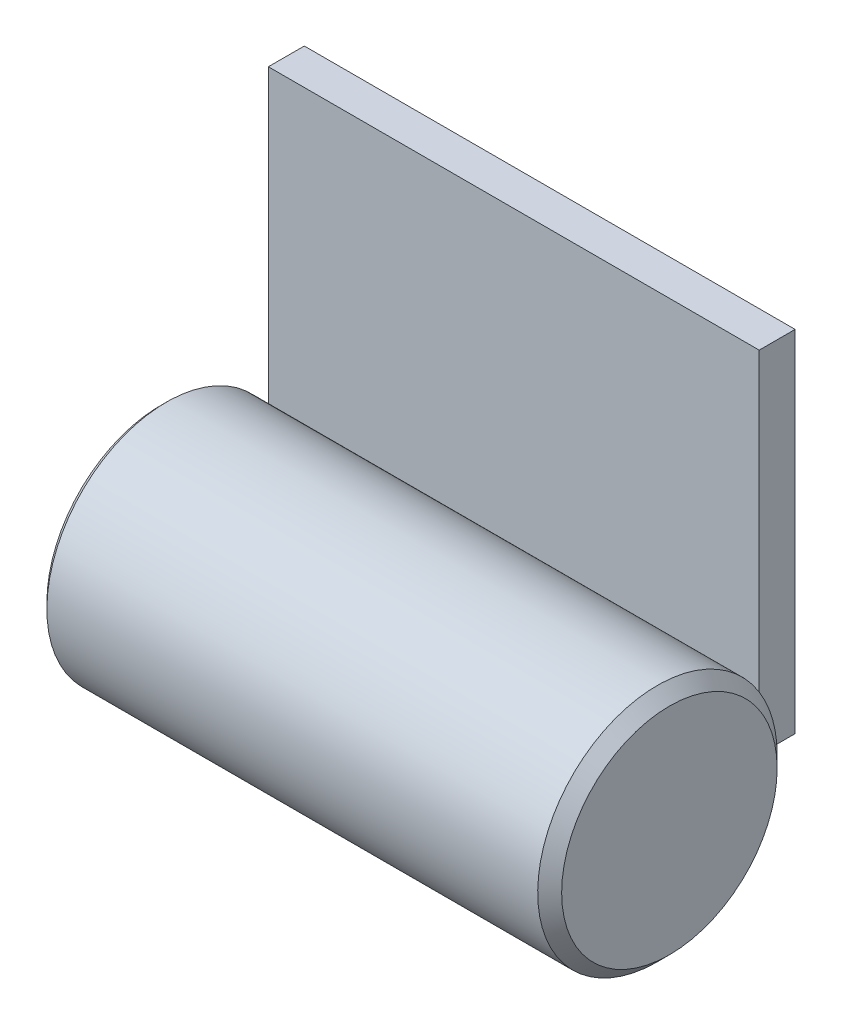
ISO-10303-21;
HEADER;
FILE_DESCRIPTION(('STEP AP214'),'2;1');
FILE_NAME('part.step','',(''),(''),'','','');
FILE_SCHEMA(('AUTOMOTIVE_DESIGN { 1 0 10303 214 1 1 1 1 }'));
ENDSEC;
DATA;
#1=APPLICATION_CONTEXT('core data for automotive mechanical design processes');
#2=APPLICATION_PROTOCOL_DEFINITION('international standard','automotive_design',2000,#1);
#3=PRODUCT_CONTEXT('',#1,'mechanical');
#4=PRODUCT('Part','Part','',(#3));
#5=PRODUCT_RELATED_PRODUCT_CATEGORY('part','',(#4));
#6=PRODUCT_DEFINITION_FORMATION('','',#4);
#7=PRODUCT_DEFINITION_CONTEXT('part definition',#1,'design');
#8=PRODUCT_DEFINITION('design','',#6,#7);
#9=PRODUCT_DEFINITION_SHAPE('','',#8);
#10=(LENGTH_UNIT() NAMED_UNIT(*) SI_UNIT(.MILLI.,.METRE.));
#11=(NAMED_UNIT(*) PLANE_ANGLE_UNIT() SI_UNIT($,.RADIAN.));
#12=(NAMED_UNIT(*) SI_UNIT($,.STERADIAN.) SOLID_ANGLE_UNIT());
#13=UNCERTAINTY_MEASURE_WITH_UNIT(LENGTH_MEASURE(1.E-05),#10,'distance_accuracy_value','');
#14=(GEOMETRIC_REPRESENTATION_CONTEXT(3) GLOBAL_UNCERTAINTY_ASSIGNED_CONTEXT((#13)) GLOBAL_UNIT_ASSIGNED_CONTEXT((#10,
#11,#12)) REPRESENTATION_CONTEXT('',''));
#15=CARTESIAN_POINT('',(0.,0.,0.));
#16=DIRECTION('',(0.,0.,1.));
#17=DIRECTION('',(1.,0.,0.));
#18=AXIS2_PLACEMENT_3D('',#15,#16,#17);
#19=CARTESIAN_POINT('',(90.6528747196546,60.,-23.0049280207155));
#20=DIRECTION('',(0.,0.,1.));
#21=DIRECTION('',(1.,0.,0.));
#22=AXIS2_PLACEMENT_3D('',#19,#20,#21);
#23=PLANE('',#22);
#24=DIRECTION('',(1.,0.,0.));
#25=VECTOR('',#24,1.);
#26=CARTESIAN_POINT('',(90.6528747196546,1.5,-23.0049280207155));
#27=LINE('',#26,#25);
#28=CARTESIAN_POINT('',(8.6528747196546,1.5,-23.0049280207155));
#29=VERTEX_POINT('',#28);
#30=CARTESIAN_POINT('',(90.6528747196546,1.5,-23.0049280207155));
#31=VERTEX_POINT('',#30);
#32=EDGE_CURVE('E102',#29,#31,#27,.T.);
#33=ORIENTED_EDGE('',*,*,#32,.F.);
#34=DIRECTION('',(0.,-1.,0.));
#35=VECTOR('',#34,1.);
#36=CARTESIAN_POINT('',(8.6528747196546,60.,-23.0049280207155));
#37=LINE('',#36,#35);
#38=CARTESIAN_POINT('',(8.6528747196546,60.,-23.0049280207155));
#39=VERTEX_POINT('',#38);
#40=EDGE_CURVE('E129',#39,#29,#37,.T.);
#41=ORIENTED_EDGE('',*,*,#40,.F.);
#42=DIRECTION('',(-1.,0.,0.));
#43=VECTOR('',#42,1.);
#44=CARTESIAN_POINT('',(90.6528747196546,60.,-23.0049280207155));
#45=LINE('',#44,#43);
#46=CARTESIAN_POINT('',(90.6528747196546,60.,-23.0049280207155));
#47=VERTEX_POINT('',#46);
#48=EDGE_CURVE('E118',#47,#39,#45,.T.);
#49=ORIENTED_EDGE('',*,*,#48,.F.);
#50=DIRECTION('',(0.,-1.,0.));
#51=VECTOR('',#50,1.);
#52=CARTESIAN_POINT('',(90.6528747196546,60.,-23.0049280207155));
#53=LINE('',#52,#51);
#54=EDGE_CURVE('E132',#47,#31,#53,.T.);
#55=ORIENTED_EDGE('',*,*,#54,.T.);
#56=EDGE_LOOP('',(#33,#41,#49,#55));
#57=FACE_BOUND('',#56,.T.);
#58=ADVANCED_FACE('F35',(#57),#23,.F.);
#59=CARTESIAN_POINT('',(102.994030823935,0.,0.));
#60=DIRECTION('',(1.,0.,0.));
#61=DIRECTION('',(0.,0.,-1.));
#62=AXIS2_PLACEMENT_3D('',#59,#60,#61);
#63=CYLINDRICAL_SURFACE('',#62,20.);
#64=CARTESIAN_POINT('',(90.6528747196546,0.,0.));
#65=DIRECTION('',(1.,0.,0.));
#66=DIRECTION('',(0.,0.,-1.));
#67=AXIS2_PLACEMENT_3D('',#64,#65,#66);
#68=CIRCLE('',#67,20.);
#69=CARTESIAN_POINT('',(90.6528747196546,10.5296960307727,-17.0036908199229));
#70=VERTEX_POINT('',#69);
#71=CARTESIAN_POINT('',(90.6528747196546,0.,-20.));
#72=VERTEX_POINT('',#71);
#73=EDGE_CURVE('E49',#70,#72,#68,.T.);
#74=ORIENTED_EDGE('',*,*,#73,.F.);
#75=DIRECTION('',(1.,0.,0.));
#76=VECTOR('',#75,1.);
#77=CARTESIAN_POINT('',(102.994030823935,10.5296960307727,-17.0036908199229));
#78=LINE('',#77,#76);
#79=CARTESIAN_POINT('',(8.6528747196546,10.5296960307726,-17.0036908199229));
#80=VERTEX_POINT('',#79);
#81=EDGE_CURVE('E134',#70,#80,#78,.F.);
#82=ORIENTED_EDGE('',*,*,#81,.T.);
#83=CARTESIAN_POINT('',(8.6528747196546,0.,0.));
#84=DIRECTION('',(1.,0.,0.));
#85=DIRECTION('',(0.,0.,-1.));
#86=AXIS2_PLACEMENT_3D('',#83,#84,#85);
#87=CIRCLE('',#86,20.);
#88=CARTESIAN_POINT('',(8.6528747196546,0.,-20.));
#89=VERTEX_POINT('',#88);
#90=EDGE_CURVE('E151',#80,#89,#87,.T.);
#91=ORIENTED_EDGE('',*,*,#90,.T.);
#92=DIRECTION('',(1.,0.,0.));
#93=VECTOR('',#92,1.);
#94=CARTESIAN_POINT('',(102.994030823935,0.,-20.));
#95=LINE('',#94,#93);
#96=EDGE_CURVE('E11',#89,#72,#95,.T.);
#97=ORIENTED_EDGE('',*,*,#96,.T.);
#98=EDGE_LOOP('',(#74,#82,#91,#97));
#99=FACE_BOUND('',#98,.T.);
#100=ADVANCED_FACE('F170',(#99),#63,.T.);
#101=CARTESIAN_POINT('',(92.6528747196546,0.,0.));
#102=DIRECTION('',(1.,0.,0.));
#103=DIRECTION('',(0.,0.,-1.));
#104=AXIS2_PLACEMENT_3D('',#101,#102,#103);
#105=PLANE('',#104);
#106=CARTESIAN_POINT('',(92.6528747196546,0.,0.));
#107=DIRECTION('',(1.,0.,0.));
#108=DIRECTION('',(0.,0.,-1.));
#109=AXIS2_PLACEMENT_3D('',#106,#107,#108);
#110=CIRCLE('',#109,18.);
#111=CARTESIAN_POINT('',(92.6528747196546,0.,-18.));
#112=VERTEX_POINT('',#111);
#113=EDGE_CURVE('E43',#112,#112,#110,.T.);
#114=ORIENTED_EDGE('',*,*,#113,.T.);
#115=EDGE_LOOP('',(#114));
#116=FACE_BOUND('',#115,.T.);
#117=ADVANCED_FACE('F37',(#116),#105,.T.);
#118=CARTESIAN_POINT('',(92.6528747196546,0.,0.));
#119=DIRECTION('',(-1.,0.,0.));
#120=DIRECTION('',(0.,0.,1.));
#121=AXIS2_PLACEMENT_3D('',#118,#119,#120);
#122=CONICAL_SURFACE('',#121,18.,0.785398163397452);
#123=EDGE_CURVE('E110',#72,#70,#68,.T.);
#124=ORIENTED_EDGE('',*,*,#123,.T.);
#125=ORIENTED_EDGE('',*,*,#73,.T.);
#126=EDGE_LOOP('',(#124,#125));
#127=FACE_BOUND('',#126,.T.);
#128=ORIENTED_EDGE('',*,*,#113,.F.);
#129=EDGE_LOOP('',(#128));
#130=FACE_BOUND('',#129,.T.);
#131=ADVANCED_FACE('F159',(#127,#130),#122,.T.);
#132=CARTESIAN_POINT('',(8.6528747196546,0.,0.));
#133=DIRECTION('',(1.,0.,0.));
#134=DIRECTION('',(0.,0.,-1.));
#135=AXIS2_PLACEMENT_3D('',#132,#133,#134);
#136=CONICAL_SURFACE('',#135,20.,0.785398163397452);
#137=CARTESIAN_POINT('',(7.6528747196546,0.,0.));
#138=DIRECTION('',(1.,0.,0.));
#139=DIRECTION('',(0.,0.,-1.));
#140=AXIS2_PLACEMENT_3D('',#137,#138,#139);
#141=CIRCLE('',#140,19.);
#142=CARTESIAN_POINT('',(7.6528747196546,0.,-19.));
#143=VERTEX_POINT('',#142);
#144=EDGE_CURVE('E148',#143,#143,#141,.T.);
#145=ORIENTED_EDGE('',*,*,#144,.T.);
#146=EDGE_LOOP('',(#145));
#147=FACE_BOUND('',#146,.T.);
#148=EDGE_CURVE('E152',#89,#80,#87,.T.);
#149=ORIENTED_EDGE('',*,*,#148,.F.);
#150=ORIENTED_EDGE('',*,*,#90,.F.);
#151=EDGE_LOOP('',(#149,#150));
#152=FACE_BOUND('',#151,.T.);
#153=ADVANCED_FACE('F161',(#147,#152),#136,.T.);
#154=CARTESIAN_POINT('',(7.6528747196546,0.,-19.));
#155=DIRECTION('',(-1.,0.,0.));
#156=DIRECTION('',(0.,0.,1.));
#157=AXIS2_PLACEMENT_3D('',#154,#155,#156);
#158=PLANE('',#157);
#159=CARTESIAN_POINT('',(7.6528747196546,0.,0.));
#160=DIRECTION('',(1.,0.,0.));
#161=DIRECTION('',(0.,0.,-1.));
#162=AXIS2_PLACEMENT_3D('',#159,#160,#161);
#163=CIRCLE('',#162,14.7500466259145);
#164=CARTESIAN_POINT('',(7.6528747196546,0.,-14.7500466259145));
#165=VERTEX_POINT('',#164);
#166=EDGE_CURVE('E145',#165,#165,#163,.T.);
#167=ORIENTED_EDGE('',*,*,#166,.T.);
#168=EDGE_LOOP('',(#167));
#169=FACE_BOUND('',#168,.T.);
#170=ORIENTED_EDGE('',*,*,#144,.F.);
#171=EDGE_LOOP('',(#170));
#172=FACE_BOUND('',#171,.T.);
#173=ADVANCED_FACE('F167',(#169,#172),#158,.T.);
#174=CARTESIAN_POINT('',(7.6528747196546,0.,0.));
#175=DIRECTION('',(-1.,0.,0.));
#176=DIRECTION('',(0.,0.,1.));
#177=AXIS2_PLACEMENT_3D('',#174,#175,#176);
#178=CONICAL_SURFACE('',#177,14.7500466259145,0.785398163397448);
#179=CARTESIAN_POINT('',(8.6528747196546,0.,0.));
#180=DIRECTION('',(1.,0.,0.));
#181=DIRECTION('',(0.,0.,-1.));
#182=AXIS2_PLACEMENT_3D('',#179,#180,#181);
#183=CIRCLE('',#182,13.7500466259145);
#184=CARTESIAN_POINT('',(8.6528747196546,0.,-13.7500466259145));
#185=VERTEX_POINT('',#184);
#186=EDGE_CURVE('E142',#185,#185,#183,.T.);
#187=ORIENTED_EDGE('',*,*,#186,.T.);
#188=EDGE_LOOP('',(#187));
#189=FACE_BOUND('',#188,.T.);
#190=ORIENTED_EDGE('',*,*,#166,.F.);
#191=EDGE_LOOP('',(#190));
#192=FACE_BOUND('',#191,.T.);
#193=ADVANCED_FACE('F195',(#189,#192),#178,.F.);
#194=CARTESIAN_POINT('',(102.994030823935,0.,0.));
#195=DIRECTION('',(1.,0.,0.));
#196=DIRECTION('',(0.,0.,-1.));
#197=AXIS2_PLACEMENT_3D('',#194,#195,#196);
#198=CYLINDRICAL_SURFACE('',#197,13.7500466259145);
#199=CARTESIAN_POINT('',(71.6294297140758,0.,0.));
#200=DIRECTION('',(1.,0.,0.));
#201=DIRECTION('',(0.,0.,-1.));
#202=AXIS2_PLACEMENT_3D('',#199,#200,#201);
#203=CIRCLE('',#202,13.7500466259145);
#204=CARTESIAN_POINT('',(71.6294297140758,0.,-13.7500466259145));
#205=VERTEX_POINT('',#204);
#206=EDGE_CURVE('E139',#205,#205,#203,.T.);
#207=ORIENTED_EDGE('',*,*,#206,.T.);
#208=EDGE_LOOP('',(#207));
#209=FACE_BOUND('',#208,.T.);
#210=ORIENTED_EDGE('',*,*,#186,.F.);
#211=EDGE_LOOP('',(#210));
#212=FACE_BOUND('',#211,.T.);
#213=ADVANCED_FACE('F191',(#209,#212),#198,.F.);
#214=CARTESIAN_POINT('',(71.6294297140758,0.,-3.43020549685093));
#215=DIRECTION('',(-1.,0.,0.));
#216=DIRECTION('',(0.,0.,1.));
#217=AXIS2_PLACEMENT_3D('',#214,#215,#216);
#218=PLANE('',#217);
#219=CARTESIAN_POINT('',(71.6294297140758,0.,0.));
#220=DIRECTION('',(1.,0.,0.));
#221=DIRECTION('',(0.,0.,-1.));
#222=AXIS2_PLACEMENT_3D('',#219,#220,#221);
#223=CIRCLE('',#222,3.43020549685093);
#224=CARTESIAN_POINT('',(71.6294297140758,0.,-3.43020549685093));
#225=VERTEX_POINT('',#224);
#226=EDGE_CURVE('E136',#225,#225,#223,.T.);
#227=ORIENTED_EDGE('',*,*,#226,.T.);
#228=EDGE_LOOP('',(#227));
#229=FACE_BOUND('',#228,.T.);
#230=ORIENTED_EDGE('',*,*,#206,.F.);
#231=EDGE_LOOP('',(#230));
#232=FACE_BOUND('',#231,.T.);
#233=ADVANCED_FACE('F187',(#229,#232),#218,.T.);
#234=CARTESIAN_POINT('',(71.6294297140758,0.,0.));
#235=DIRECTION('',(-1.,0.,0.));
#236=DIRECTION('',(0.,0.,1.));
#237=AXIS2_PLACEMENT_3D('',#234,#235,#236);
#238=CONICAL_SURFACE('',#237,3.43020549685093,0.585875576414255);
#239=CARTESIAN_POINT('',(76.7985263485862,0.,0.));
#240=VERTEX_POINT('',#239);
#241=VERTEX_LOOP('',#240);
#242=FACE_BOUND('',#241,.T.);
#243=ORIENTED_EDGE('',*,*,#226,.F.);
#244=EDGE_LOOP('',(#243));
#245=FACE_BOUND('',#244,.T.);
#246=ADVANCED_FACE('F184',(#242,#245),#238,.F.);
#247=CARTESIAN_POINT('',(90.6528747196546,60.,-17.0036908199229));
#248=DIRECTION('',(-1.,0.,0.));
#249=DIRECTION('',(0.,0.,1.));
#250=AXIS2_PLACEMENT_3D('',#247,#248,#249);
#251=PLANE('',#250);
#252=ORIENTED_EDGE('',*,*,#123,.F.);
#253=DIRECTION('',(0.,-1.,0.));
#254=VECTOR('',#253,1.);
#255=CARTESIAN_POINT('',(90.6528747196546,1.5,-20.));
#256=LINE('',#255,#254);
#257=CARTESIAN_POINT('',(90.6528747196546,1.5,-20.));
#258=VERTEX_POINT('',#257);
#259=EDGE_CURVE('E57',#258,#72,#256,.T.);
#260=ORIENTED_EDGE('',*,*,#259,.F.);
#261=DIRECTION('',(0.,0.,1.));
#262=VECTOR('',#261,1.);
#263=CARTESIAN_POINT('',(90.6528747196546,1.5,-23.0049280207155));
#264=LINE('',#263,#262);
#265=EDGE_CURVE('E97',#31,#258,#264,.T.);
#266=ORIENTED_EDGE('',*,*,#265,.F.);
#267=ORIENTED_EDGE('',*,*,#54,.F.);
#268=DIRECTION('',(0.,0.,-1.));
#269=VECTOR('',#268,1.);
#270=CARTESIAN_POINT('',(90.6528747196546,60.,-17.0036908199229));
#271=LINE('',#270,#269);
#272=CARTESIAN_POINT('',(90.6528747196546,60.,-17.0036908199229));
#273=VERTEX_POINT('',#272);
#274=EDGE_CURVE('E112',#273,#47,#271,.T.);
#275=ORIENTED_EDGE('',*,*,#274,.F.);
#276=DIRECTION('',(0.,-1.,0.));
#277=VECTOR('',#276,1.);
#278=CARTESIAN_POINT('',(90.6528747196546,60.,-17.0036908199229));
#279=LINE('',#278,#277);
#280=EDGE_CURVE('E124',#273,#70,#279,.T.);
#281=ORIENTED_EDGE('',*,*,#280,.T.);
#282=EDGE_LOOP('',(#252,#260,#266,#267,#275,#281));
#283=FACE_BOUND('',#282,.T.);
#284=ADVANCED_FACE('F108',(#283),#251,.F.);
#285=CARTESIAN_POINT('',(8.6528747196546,60.,-17.0036908199229));
#286=DIRECTION('',(1.,0.,0.));
#287=DIRECTION('',(0.,0.,-1.));
#288=AXIS2_PLACEMENT_3D('',#285,#286,#287);
#289=PLANE('',#288);
#290=DIRECTION('',(0.,0.,-1.));
#291=VECTOR('',#290,1.);
#292=CARTESIAN_POINT('',(8.6528747196546,1.5,-23.0049280207155));
#293=LINE('',#292,#291);
#294=CARTESIAN_POINT('',(8.6528747196546,1.5,-20.));
#295=VERTEX_POINT('',#294);
#296=EDGE_CURVE('E96',#295,#29,#293,.T.);
#297=ORIENTED_EDGE('',*,*,#296,.F.);
#298=DIRECTION('',(0.,-1.,0.));
#299=VECTOR('',#298,1.);
#300=CARTESIAN_POINT('',(8.6528747196546,1.5,-20.));
#301=LINE('',#300,#299);
#302=EDGE_CURVE('E93',#295,#89,#301,.T.);
#303=ORIENTED_EDGE('',*,*,#302,.T.);
#304=ORIENTED_EDGE('',*,*,#148,.T.);
#305=DIRECTION('',(0.,-1.,0.));
#306=VECTOR('',#305,1.);
#307=CARTESIAN_POINT('',(8.6528747196546,60.,-17.0036908199229));
#308=LINE('',#307,#306);
#309=CARTESIAN_POINT('',(8.6528747196546,60.,-17.0036908199229));
#310=VERTEX_POINT('',#309);
#311=EDGE_CURVE('E126',#310,#80,#308,.T.);
#312=ORIENTED_EDGE('',*,*,#311,.F.);
#313=DIRECTION('',(0.,0.,1.));
#314=VECTOR('',#313,1.);
#315=CARTESIAN_POINT('',(8.6528747196546,60.,-17.0036908199229));
#316=LINE('',#315,#314);
#317=EDGE_CURVE('E120',#39,#310,#316,.T.);
#318=ORIENTED_EDGE('',*,*,#317,.F.);
#319=ORIENTED_EDGE('',*,*,#40,.T.);
#320=EDGE_LOOP('',(#297,#303,#304,#312,#318,#319));
#321=FACE_BOUND('',#320,.T.);
#322=ADVANCED_FACE('F180',(#321),#289,.F.);
#323=CARTESIAN_POINT('',(90.6528747196546,60.,-17.0036908199229));
#324=DIRECTION('',(0.,0.,-1.));
#325=DIRECTION('',(-1.,0.,0.));
#326=AXIS2_PLACEMENT_3D('',#323,#324,#325);
#327=PLANE('',#326);
#328=ORIENTED_EDGE('',*,*,#81,.F.);
#329=ORIENTED_EDGE('',*,*,#280,.F.);
#330=DIRECTION('',(1.,0.,0.));
#331=VECTOR('',#330,1.);
#332=CARTESIAN_POINT('',(90.6528747196546,60.,-17.0036908199229));
#333=LINE('',#332,#331);
#334=EDGE_CURVE('E122',#310,#273,#333,.T.);
#335=ORIENTED_EDGE('',*,*,#334,.F.);
#336=ORIENTED_EDGE('',*,*,#311,.T.);
#337=EDGE_LOOP('',(#328,#329,#335,#336));
#338=FACE_BOUND('',#337,.T.);
#339=ADVANCED_FACE('F216',(#338),#327,.F.);
#340=CARTESIAN_POINT('',(0.,60.,0.));
#341=DIRECTION('',(0.,1.,0.));
#342=DIRECTION('',(0.,0.,1.));
#343=AXIS2_PLACEMENT_3D('',#340,#341,#342);
#344=PLANE('',#343);
#345=ORIENTED_EDGE('',*,*,#274,.T.);
#346=ORIENTED_EDGE('',*,*,#48,.T.);
#347=ORIENTED_EDGE('',*,*,#317,.T.);
#348=ORIENTED_EDGE('',*,*,#334,.T.);
#349=EDGE_LOOP('',(#345,#346,#347,#348));
#350=FACE_BOUND('',#349,.T.);
#351=ADVANCED_FACE('F220',(#350),#344,.T.);
#352=CARTESIAN_POINT('',(90.6528747196546,1.5,-20.));
#353=DIRECTION('',(0.,0.,1.));
#354=DIRECTION('',(1.,0.,0.));
#355=AXIS2_PLACEMENT_3D('',#352,#353,#354);
#356=PLANE('',#355);
#357=ORIENTED_EDGE('',*,*,#96,.F.);
#358=ORIENTED_EDGE('',*,*,#302,.F.);
#359=DIRECTION('',(-1.,0.,0.));
#360=VECTOR('',#359,1.);
#361=CARTESIAN_POINT('',(90.6528747196546,1.5,-20.));
#362=LINE('',#361,#360);
#363=EDGE_CURVE('E89',#258,#295,#362,.T.);
#364=ORIENTED_EDGE('',*,*,#363,.F.);
#365=ORIENTED_EDGE('',*,*,#259,.T.);
#366=EDGE_LOOP('',(#357,#358,#364,#365));
#367=FACE_BOUND('',#366,.T.);
#368=ADVANCED_FACE('F91',(#367),#356,.F.);
#369=CARTESIAN_POINT('',(0.,1.5,0.));
#370=DIRECTION('',(0.,-1.,0.));
#371=DIRECTION('',(0.,0.,-1.));
#372=AXIS2_PLACEMENT_3D('',#369,#370,#371);
#373=PLANE('',#372);
#374=ORIENTED_EDGE('',*,*,#265,.T.);
#375=ORIENTED_EDGE('',*,*,#363,.T.);
#376=ORIENTED_EDGE('',*,*,#296,.T.);
#377=ORIENTED_EDGE('',*,*,#32,.T.);
#378=EDGE_LOOP('',(#374,#375,#376,#377));
#379=FACE_BOUND('',#378,.T.);
#380=ADVANCED_FACE('F100',(#379),#373,.T.);
#381=CLOSED_SHELL('',(#58,#100,#117,#131,#153,#173,#193,#213,#233,#246,#284,#322,#339,#351,#368,#380));
#382=MANIFOLD_SOLID_BREP('B2',#381);
#383=ADVANCED_BREP_SHAPE_REPRESENTATION('',(#18,#382),#14);
#384=SHAPE_DEFINITION_REPRESENTATION(#9,#383);
ENDSEC;
END-ISO-10303-21;
